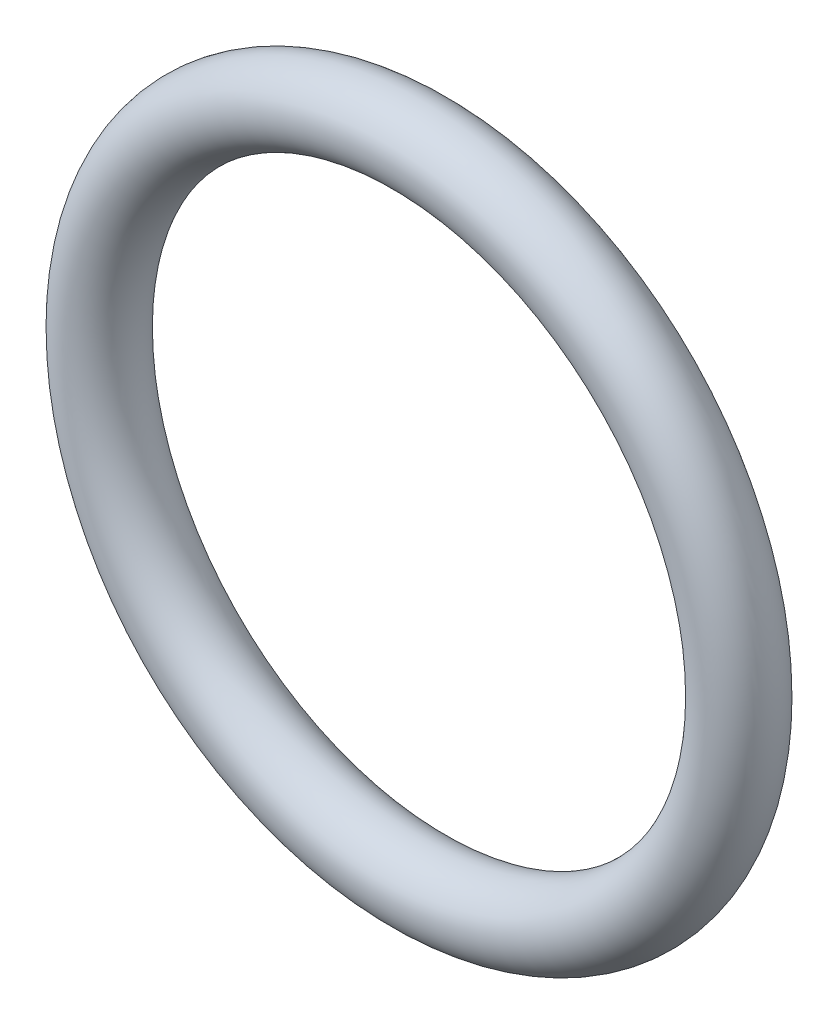
ISO-10303-21;
HEADER;
FILE_DESCRIPTION(('STEP AP214'),'2;1');
FILE_NAME('part.step','',(''),(''),'','','');
FILE_SCHEMA(('AUTOMOTIVE_DESIGN { 1 0 10303 214 1 1 1 1 }'));
ENDSEC;
DATA;
#1=APPLICATION_CONTEXT('core data for automotive mechanical design processes');
#2=APPLICATION_PROTOCOL_DEFINITION('international standard','automotive_design',2000,#1);
#3=PRODUCT_CONTEXT('',#1,'mechanical');
#4=PRODUCT('Part','Part','',(#3));
#5=PRODUCT_RELATED_PRODUCT_CATEGORY('part','',(#4));
#6=PRODUCT_DEFINITION_FORMATION('','',#4);
#7=PRODUCT_DEFINITION_CONTEXT('part definition',#1,'design');
#8=PRODUCT_DEFINITION('design','',#6,#7);
#9=PRODUCT_DEFINITION_SHAPE('','',#8);
#10=(LENGTH_UNIT() NAMED_UNIT(*) SI_UNIT(.MILLI.,.METRE.));
#11=(NAMED_UNIT(*) PLANE_ANGLE_UNIT() SI_UNIT($,.RADIAN.));
#12=(NAMED_UNIT(*) SI_UNIT($,.STERADIAN.) SOLID_ANGLE_UNIT());
#13=UNCERTAINTY_MEASURE_WITH_UNIT(LENGTH_MEASURE(1.E-05),#10,'distance_accuracy_value','');
#14=(GEOMETRIC_REPRESENTATION_CONTEXT(3) GLOBAL_UNCERTAINTY_ASSIGNED_CONTEXT((#13)) GLOBAL_UNIT_ASSIGNED_CONTEXT((#10,
#11,#12)) REPRESENTATION_CONTEXT('',''));
#15=CARTESIAN_POINT('',(0.,0.,0.));
#16=DIRECTION('',(0.,0.,1.));
#17=DIRECTION('',(1.,0.,0.));
#18=AXIS2_PLACEMENT_3D('',#15,#16,#17);
#19=CARTESIAN_POINT('',(0.,0.,0.));
#20=DIRECTION('',(0.,0.,1.));
#21=DIRECTION('',(1.,0.,0.));
#22=AXIS2_PLACEMENT_3D('',#19,#20,#21);
#23=TOROIDAL_SURFACE('',#22,21.25,2.5);
#24=CARTESIAN_POINT('',(21.25,0.,0.));
#25=DIRECTION('',(0.,1.,0.));
#26=DIRECTION('',(-1.,0.,0.));
#27=AXIS2_PLACEMENT_3D('',#24,#25,#26);
#28=CIRCLE('',#27,2.5);
#29=CARTESIAN_POINT('',(23.75,0.,0.));
#30=VERTEX_POINT('',#29);
#31=EDGE_CURVE('E11',#30,#30,#28,.T.);
#32=CARTESIAN_POINT('',(0.,0.,0.));
#33=DIRECTION('',(0.,0.,1.));
#34=DIRECTION('',(1.,0.,0.));
#35=AXIS2_PLACEMENT_3D('',#32,#33,#34);
#36=CIRCLE('',#35,23.75);
#37=EDGE_CURVE('',#30,#30,#36,.T.);
#38=ORIENTED_EDGE('',*,*,#31,.T.);
#39=ORIENTED_EDGE('',*,*,#31,.F.);
#40=ORIENTED_EDGE('',*,*,#37,.T.);
#41=ORIENTED_EDGE('',*,*,#37,.F.);
#42=EDGE_LOOP('',(#38,#40,#39,#41));
#43=FACE_BOUND('',#42,.T.);
#44=ADVANCED_FACE('F47',(#43),#23,.T.);
#45=CLOSED_SHELL('',(#44));
#46=MANIFOLD_SOLID_BREP('B2',#45);
#47=ADVANCED_BREP_SHAPE_REPRESENTATION('',(#18,#46),#14);
#48=SHAPE_DEFINITION_REPRESENTATION(#9,#47);
ENDSEC;
END-ISO-10303-21;
